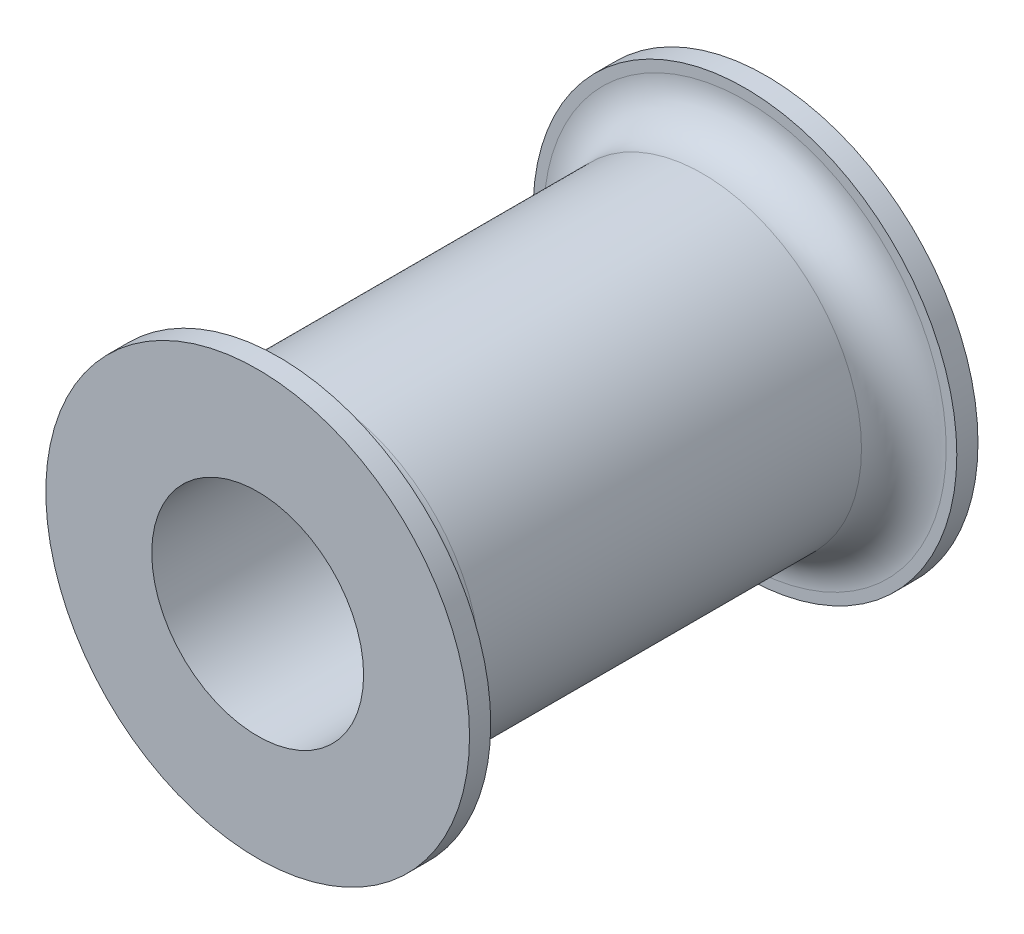
ISO-10303-21;
HEADER;
FILE_DESCRIPTION(('STEP AP214'),'2;1');
FILE_NAME('part.step','',(''),(''),'','','');
FILE_SCHEMA(('AUTOMOTIVE_DESIGN { 1 0 10303 214 1 1 1 1 }'));
ENDSEC;
DATA;
#1=APPLICATION_CONTEXT('core data for automotive mechanical design processes');
#2=APPLICATION_PROTOCOL_DEFINITION('international standard','automotive_design',2000,#1);
#3=PRODUCT_CONTEXT('',#1,'mechanical');
#4=PRODUCT('Part','Part','',(#3));
#5=PRODUCT_RELATED_PRODUCT_CATEGORY('part','',(#4));
#6=PRODUCT_DEFINITION_FORMATION('','',#4);
#7=PRODUCT_DEFINITION_CONTEXT('part definition',#1,'design');
#8=PRODUCT_DEFINITION('design','',#6,#7);
#9=PRODUCT_DEFINITION_SHAPE('','',#8);
#10=(LENGTH_UNIT() NAMED_UNIT(*) SI_UNIT(.MILLI.,.METRE.));
#11=(NAMED_UNIT(*) PLANE_ANGLE_UNIT() SI_UNIT($,.RADIAN.));
#12=(NAMED_UNIT(*) SI_UNIT($,.STERADIAN.) SOLID_ANGLE_UNIT());
#13=UNCERTAINTY_MEASURE_WITH_UNIT(LENGTH_MEASURE(1.E-05),#10,'distance_accuracy_value','');
#14=(GEOMETRIC_REPRESENTATION_CONTEXT(3) GLOBAL_UNCERTAINTY_ASSIGNED_CONTEXT((#13)) GLOBAL_UNIT_ASSIGNED_CONTEXT((#10,
#11,#12)) REPRESENTATION_CONTEXT('',''));
#15=CARTESIAN_POINT('',(0.,0.,0.));
#16=DIRECTION('',(0.,0.,1.));
#17=DIRECTION('',(1.,0.,0.));
#18=AXIS2_PLACEMENT_3D('',#15,#16,#17);
#19=CARTESIAN_POINT('',(0.,0.,0.5));
#20=DIRECTION('',(0.,0.,-1.));
#21=DIRECTION('',(-1.,0.,0.));
#22=AXIS2_PLACEMENT_3D('',#19,#20,#21);
#23=CYLINDRICAL_SURFACE('',#22,5.);
#24=CARTESIAN_POINT('',(0.,0.,0.5));
#25=DIRECTION('',(0.,0.,1.));
#26=DIRECTION('',(1.,0.,0.));
#27=AXIS2_PLACEMENT_3D('',#24,#25,#26);
#28=CIRCLE('',#27,5.);
#29=CARTESIAN_POINT('',(5.,0.,0.5));
#30=VERTEX_POINT('',#29);
#31=EDGE_CURVE('E54',#30,#30,#28,.T.);
#32=ORIENTED_EDGE('',*,*,#31,.F.);
#33=EDGE_LOOP('',(#32));
#34=FACE_BOUND('',#33,.T.);
#35=CARTESIAN_POINT('',(0.,0.,0.));
#36=DIRECTION('',(0.,0.,1.));
#37=DIRECTION('',(1.,0.,0.));
#38=AXIS2_PLACEMENT_3D('',#35,#36,#37);
#39=CIRCLE('',#38,5.);
#40=CARTESIAN_POINT('',(5.,0.,0.));
#41=VERTEX_POINT('',#40);
#42=EDGE_CURVE('E55',#41,#41,#39,.T.);
#43=ORIENTED_EDGE('',*,*,#42,.T.);
#44=EDGE_LOOP('',(#43));
#45=FACE_BOUND('',#44,.T.);
#46=ADVANCED_FACE('F34',(#34,#45),#23,.T.);
#47=CARTESIAN_POINT('',(0.,0.,0.5));
#48=DIRECTION('',(0.,0.,1.));
#49=DIRECTION('',(1.,0.,0.));
#50=AXIS2_PLACEMENT_3D('',#47,#48,#49);
#51=PLANE('',#50);
#52=CARTESIAN_POINT('',(0.,0.,0.5));
#53=DIRECTION('',(0.,0.,1.));
#54=DIRECTION('',(1.,0.,0.));
#55=AXIS2_PLACEMENT_3D('',#52,#53,#54);
#56=CIRCLE('',#55,4.75);
#57=CARTESIAN_POINT('',(4.75,0.,0.5));
#58=VERTEX_POINT('',#57);
#59=EDGE_CURVE('E10',#58,#58,#56,.F.);
#60=ORIENTED_EDGE('',*,*,#59,.T.);
#61=EDGE_LOOP('',(#60));
#62=FACE_BOUND('',#61,.T.);
#63=ORIENTED_EDGE('',*,*,#31,.T.);
#64=EDGE_LOOP('',(#63));
#65=FACE_BOUND('',#64,.T.);
#66=ADVANCED_FACE('F103',(#62,#65),#51,.T.);
#67=CARTESIAN_POINT('',(0.,0.,0.));
#68=DIRECTION('',(0.,0.,1.));
#69=DIRECTION('',(1.,0.,0.));
#70=AXIS2_PLACEMENT_3D('',#67,#68,#69);
#71=PLANE('',#70);
#72=CARTESIAN_POINT('',(0.,0.,0.));
#73=DIRECTION('',(0.,0.,1.));
#74=DIRECTION('',(1.,0.,0.));
#75=AXIS2_PLACEMENT_3D('',#72,#73,#74);
#76=CIRCLE('',#75,2.5);
#77=CARTESIAN_POINT('',(2.5,0.,0.));
#78=VERTEX_POINT('',#77);
#79=EDGE_CURVE('E64',#78,#78,#76,.T.);
#80=ORIENTED_EDGE('',*,*,#79,.T.);
#81=EDGE_LOOP('',(#80));
#82=FACE_BOUND('',#81,.T.);
#83=ORIENTED_EDGE('',*,*,#42,.F.);
#84=EDGE_LOOP('',(#83));
#85=FACE_BOUND('',#84,.T.);
#86=ADVANCED_FACE('F73',(#82,#85),#71,.F.);
#87=CARTESIAN_POINT('',(0.,0.,11.5));
#88=DIRECTION('',(0.,0.,-1.));
#89=DIRECTION('',(-1.,0.,0.));
#90=AXIS2_PLACEMENT_3D('',#87,#88,#89);
#91=CYLINDRICAL_SURFACE('',#90,3.75);
#92=CARTESIAN_POINT('',(0.,0.,10.5));
#93=DIRECTION('',(0.,0.,1.));
#94=DIRECTION('',(1.,0.,0.));
#95=AXIS2_PLACEMENT_3D('',#92,#93,#94);
#96=CIRCLE('',#95,3.75);
#97=CARTESIAN_POINT('',(3.75,0.,10.5));
#98=VERTEX_POINT('',#97);
#99=EDGE_CURVE('E41',#98,#98,#96,.F.);
#100=ORIENTED_EDGE('',*,*,#99,.T.);
#101=EDGE_LOOP('',(#100));
#102=FACE_BOUND('',#101,.T.);
#103=CARTESIAN_POINT('',(0.,0.,1.5));
#104=DIRECTION('',(0.,0.,1.));
#105=DIRECTION('',(1.,0.,0.));
#106=AXIS2_PLACEMENT_3D('',#103,#104,#105);
#107=CIRCLE('',#106,3.75);
#108=CARTESIAN_POINT('',(3.75,0.,1.5));
#109=VERTEX_POINT('',#108);
#110=EDGE_CURVE('E45',#109,#109,#107,.T.);
#111=ORIENTED_EDGE('',*,*,#110,.T.);
#112=EDGE_LOOP('',(#111));
#113=FACE_BOUND('',#112,.T.);
#114=ADVANCED_FACE('F93',(#102,#113),#91,.T.);
#115=CARTESIAN_POINT('',(0.,0.,12.));
#116=DIRECTION('',(0.,0.,-1.));
#117=DIRECTION('',(-1.,0.,0.));
#118=AXIS2_PLACEMENT_3D('',#115,#116,#117);
#119=CYLINDRICAL_SURFACE('',#118,5.);
#120=CARTESIAN_POINT('',(0.,0.,12.));
#121=DIRECTION('',(0.,0.,1.));
#122=DIRECTION('',(1.,0.,0.));
#123=AXIS2_PLACEMENT_3D('',#120,#121,#122);
#124=CIRCLE('',#123,5.);
#125=CARTESIAN_POINT('',(5.,0.,12.));
#126=VERTEX_POINT('',#125);
#127=EDGE_CURVE('E58',#126,#126,#124,.T.);
#128=ORIENTED_EDGE('',*,*,#127,.F.);
#129=EDGE_LOOP('',(#128));
#130=FACE_BOUND('',#129,.T.);
#131=CARTESIAN_POINT('',(0.,0.,11.5));
#132=DIRECTION('',(0.,0.,1.));
#133=DIRECTION('',(1.,0.,0.));
#134=AXIS2_PLACEMENT_3D('',#131,#132,#133);
#135=CIRCLE('',#134,5.);
#136=CARTESIAN_POINT('',(5.,0.,11.5));
#137=VERTEX_POINT('',#136);
#138=EDGE_CURVE('E61',#137,#137,#135,.T.);
#139=ORIENTED_EDGE('',*,*,#138,.T.);
#140=EDGE_LOOP('',(#139));
#141=FACE_BOUND('',#140,.T.);
#142=ADVANCED_FACE('F87',(#130,#141),#119,.T.);
#143=CARTESIAN_POINT('',(0.,0.,12.));
#144=DIRECTION('',(0.,0.,1.));
#145=DIRECTION('',(1.,0.,0.));
#146=AXIS2_PLACEMENT_3D('',#143,#144,#145);
#147=PLANE('',#146);
#148=CARTESIAN_POINT('',(0.,0.,12.));
#149=DIRECTION('',(0.,0.,1.));
#150=DIRECTION('',(1.,0.,0.));
#151=AXIS2_PLACEMENT_3D('',#148,#149,#150);
#152=CIRCLE('',#151,2.5);
#153=CARTESIAN_POINT('',(2.5,0.,12.));
#154=VERTEX_POINT('',#153);
#155=EDGE_CURVE('E67',#154,#154,#152,.T.);
#156=ORIENTED_EDGE('',*,*,#155,.F.);
#157=EDGE_LOOP('',(#156));
#158=FACE_BOUND('',#157,.T.);
#159=ORIENTED_EDGE('',*,*,#127,.T.);
#160=EDGE_LOOP('',(#159));
#161=FACE_BOUND('',#160,.T.);
#162=ADVANCED_FACE('F84',(#158,#161),#147,.T.);
#163=CARTESIAN_POINT('',(0.,0.,11.5));
#164=DIRECTION('',(0.,0.,1.));
#165=DIRECTION('',(1.,0.,0.));
#166=AXIS2_PLACEMENT_3D('',#163,#164,#165);
#167=PLANE('',#166);
#168=CARTESIAN_POINT('',(0.,0.,11.5));
#169=DIRECTION('',(0.,0.,1.));
#170=DIRECTION('',(1.,0.,0.));
#171=AXIS2_PLACEMENT_3D('',#168,#169,#170);
#172=CIRCLE('',#171,4.75);
#173=CARTESIAN_POINT('',(4.75,0.,11.5));
#174=VERTEX_POINT('',#173);
#175=EDGE_CURVE('E49',#174,#174,#172,.T.);
#176=ORIENTED_EDGE('',*,*,#175,.T.);
#177=EDGE_LOOP('',(#176));
#178=FACE_BOUND('',#177,.T.);
#179=ORIENTED_EDGE('',*,*,#138,.F.);
#180=EDGE_LOOP('',(#179));
#181=FACE_BOUND('',#180,.T.);
#182=ADVANCED_FACE('F80',(#178,#181),#167,.F.);
#183=CARTESIAN_POINT('',(0.,0.,0.));
#184=DIRECTION('',(0.,0.,1.));
#185=DIRECTION('',(1.,0.,0.));
#186=AXIS2_PLACEMENT_3D('',#183,#184,#185);
#187=CYLINDRICAL_SURFACE('',#186,2.5);
#188=ORIENTED_EDGE('',*,*,#79,.F.);
#189=EDGE_LOOP('',(#188));
#190=FACE_BOUND('',#189,.T.);
#191=ORIENTED_EDGE('',*,*,#155,.T.);
#192=EDGE_LOOP('',(#191));
#193=FACE_BOUND('',#192,.T.);
#194=ADVANCED_FACE('F76',(#190,#193),#187,.F.);
#195=CARTESIAN_POINT('',(0.,0.,10.5));
#196=DIRECTION('',(0.,0.,1.));
#197=DIRECTION('',(1.,0.,0.));
#198=AXIS2_PLACEMENT_3D('',#195,#196,#197);
#199=TOROIDAL_SURFACE('',#198,4.75,1.);
#200=ORIENTED_EDGE('',*,*,#99,.F.);
#201=EDGE_LOOP('',(#200));
#202=FACE_BOUND('',#201,.T.);
#203=ORIENTED_EDGE('',*,*,#175,.F.);
#204=EDGE_LOOP('',(#203));
#205=FACE_BOUND('',#204,.T.);
#206=ADVANCED_FACE('F79',(#202,#205),#199,.F.);
#207=CARTESIAN_POINT('',(0.,0.,1.5));
#208=DIRECTION('',(0.,0.,1.));
#209=DIRECTION('',(1.,0.,0.));
#210=AXIS2_PLACEMENT_3D('',#207,#208,#209);
#211=TOROIDAL_SURFACE('',#210,4.75,1.);
#212=ORIENTED_EDGE('',*,*,#59,.F.);
#213=EDGE_LOOP('',(#212));
#214=FACE_BOUND('',#213,.T.);
#215=ORIENTED_EDGE('',*,*,#110,.F.);
#216=EDGE_LOOP('',(#215));
#217=FACE_BOUND('',#216,.T.);
#218=ADVANCED_FACE('F36',(#214,#217),#211,.F.);
#219=CLOSED_SHELL('',(#46,#66,#86,#114,#142,#162,#182,#194,#206,#218));
#220=MANIFOLD_SOLID_BREP('B2',#219);
#221=ADVANCED_BREP_SHAPE_REPRESENTATION('',(#18,#220),#14);
#222=SHAPE_DEFINITION_REPRESENTATION(#9,#221);
ENDSEC;
END-ISO-10303-21;
